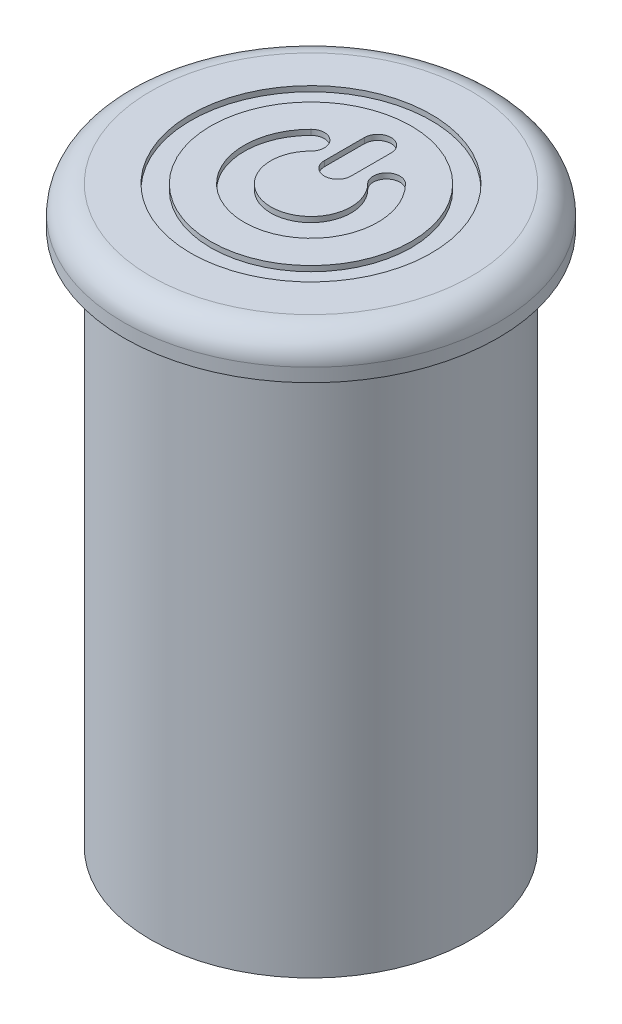
ISO-10303-21;
HEADER;
FILE_DESCRIPTION(('STEP AP214'),'2;1');
FILE_NAME('part.step','',(''),(''),'','','');
FILE_SCHEMA(('AUTOMOTIVE_DESIGN { 1 0 10303 214 1 1 1 1 }'));
ENDSEC;
DATA;
#1=APPLICATION_CONTEXT('core data for automotive mechanical design processes');
#2=APPLICATION_PROTOCOL_DEFINITION('international standard','automotive_design',2000,#1);
#3=PRODUCT_CONTEXT('',#1,'mechanical');
#4=PRODUCT('Part','Part','',(#3));
#5=PRODUCT_RELATED_PRODUCT_CATEGORY('part','',(#4));
#6=PRODUCT_DEFINITION_FORMATION('','',#4);
#7=PRODUCT_DEFINITION_CONTEXT('part definition',#1,'design');
#8=PRODUCT_DEFINITION('design','',#6,#7);
#9=PRODUCT_DEFINITION_SHAPE('','',#8);
#10=(LENGTH_UNIT() NAMED_UNIT(*) SI_UNIT(.MILLI.,.METRE.));
#11=(NAMED_UNIT(*) PLANE_ANGLE_UNIT() SI_UNIT($,.RADIAN.));
#12=(NAMED_UNIT(*) SI_UNIT($,.STERADIAN.) SOLID_ANGLE_UNIT());
#13=UNCERTAINTY_MEASURE_WITH_UNIT(LENGTH_MEASURE(1.E-05),#10,'distance_accuracy_value','');
#14=(GEOMETRIC_REPRESENTATION_CONTEXT(3) GLOBAL_UNCERTAINTY_ASSIGNED_CONTEXT((#13)) GLOBAL_UNIT_ASSIGNED_CONTEXT((#10,
#11,#12)) REPRESENTATION_CONTEXT('',''));
#15=CARTESIAN_POINT('',(0.,0.,0.));
#16=DIRECTION('',(0.,0.,1.));
#17=DIRECTION('',(1.,0.,0.));
#18=AXIS2_PLACEMENT_3D('',#15,#16,#17);
#19=CARTESIAN_POINT('',(0.,0.,0.));
#20=DIRECTION('',(0.,1.,0.));
#21=DIRECTION('',(0.,0.,1.));
#22=AXIS2_PLACEMENT_3D('',#19,#20,#21);
#23=PLANE('',#22);
#24=CARTESIAN_POINT('',(0.,0.,0.));
#25=DIRECTION('',(0.,1.,0.));
#26=DIRECTION('',(0.,0.,1.));
#27=AXIS2_PLACEMENT_3D('',#24,#25,#26);
#28=CIRCLE('',#27,4.5);
#29=CARTESIAN_POINT('',(0.,0.,4.5));
#30=VERTEX_POINT('',#29);
#31=EDGE_CURVE('E180',#30,#30,#28,.T.);
#32=ORIENTED_EDGE('',*,*,#31,.F.);
#33=EDGE_LOOP('',(#32));
#34=FACE_BOUND('',#33,.T.);
#35=CARTESIAN_POINT('',(0.,0.,0.));
#36=DIRECTION('',(0.,1.,0.));
#37=DIRECTION('',(0.,0.,1.));
#38=AXIS2_PLACEMENT_3D('',#35,#36,#37);
#39=CIRCLE('',#38,6.);
#40=CARTESIAN_POINT('',(0.,0.,6.));
#41=VERTEX_POINT('',#40);
#42=EDGE_CURVE('E12',#41,#41,#39,.T.);
#43=ORIENTED_EDGE('',*,*,#42,.T.);
#44=EDGE_LOOP('',(#43));
#45=FACE_BOUND('',#44,.T.);
#46=ADVANCED_FACE('F89',(#34,#45),#23,.T.);
#47=CARTESIAN_POINT('',(0.,0.,0.));
#48=DIRECTION('',(0.,-1.,0.));
#49=DIRECTION('',(0.,0.,-1.));
#50=AXIS2_PLACEMENT_3D('',#47,#48,#49);
#51=CYLINDRICAL_SURFACE('',#50,7.);
#52=CARTESIAN_POINT('',(0.,-1.,0.));
#53=DIRECTION('',(0.,1.,0.));
#54=DIRECTION('',(0.,0.,1.));
#55=AXIS2_PLACEMENT_3D('',#52,#53,#54);
#56=CIRCLE('',#55,7.);
#57=CARTESIAN_POINT('',(0.,-1.,7.));
#58=VERTEX_POINT('',#57);
#59=EDGE_CURVE('E97',#58,#58,#56,.F.);
#60=ORIENTED_EDGE('',*,*,#59,.T.);
#61=EDGE_LOOP('',(#60));
#62=FACE_BOUND('',#61,.T.);
#63=CARTESIAN_POINT('',(0.,-1.5,0.));
#64=DIRECTION('',(0.,-1.,0.));
#65=DIRECTION('',(0.,0.,-1.));
#66=AXIS2_PLACEMENT_3D('',#63,#64,#65);
#67=CIRCLE('',#66,7.);
#68=CARTESIAN_POINT('',(0.,-1.5,-7.));
#69=VERTEX_POINT('',#68);
#70=EDGE_CURVE('E231',#69,#69,#67,.T.);
#71=ORIENTED_EDGE('',*,*,#70,.F.);
#72=EDGE_LOOP('',(#71));
#73=FACE_BOUND('',#72,.T.);
#74=ADVANCED_FACE('F236',(#62,#73),#51,.T.);
#75=CARTESIAN_POINT('',(7.,-1.5,0.));
#76=DIRECTION('',(0.,-1.,0.));
#77=DIRECTION('',(0.,0.,-1.));
#78=AXIS2_PLACEMENT_3D('',#75,#76,#77);
#79=PLANE('',#78);
#80=ORIENTED_EDGE('',*,*,#70,.T.);
#81=EDGE_LOOP('',(#80));
#82=FACE_BOUND('',#81,.T.);
#83=CARTESIAN_POINT('',(0.,-1.5,0.));
#84=DIRECTION('',(0.,-1.,0.));
#85=DIRECTION('',(0.,0.,-1.));
#86=AXIS2_PLACEMENT_3D('',#83,#84,#85);
#87=CIRCLE('',#86,6.);
#88=CARTESIAN_POINT('',(0.,-1.5,-6.));
#89=VERTEX_POINT('',#88);
#90=EDGE_CURVE('E228',#89,#89,#87,.T.);
#91=ORIENTED_EDGE('',*,*,#90,.F.);
#92=EDGE_LOOP('',(#91));
#93=FACE_BOUND('',#92,.T.);
#94=ADVANCED_FACE('F260',(#82,#93),#79,.T.);
#95=CARTESIAN_POINT('',(0.,0.,0.));
#96=DIRECTION('',(0.,-1.,0.));
#97=DIRECTION('',(0.,0.,-1.));
#98=AXIS2_PLACEMENT_3D('',#95,#96,#97);
#99=CYLINDRICAL_SURFACE('',#98,6.);
#100=ORIENTED_EDGE('',*,*,#90,.T.);
#101=EDGE_LOOP('',(#100));
#102=FACE_BOUND('',#101,.T.);
#103=CARTESIAN_POINT('',(0.,-21.5,0.));
#104=DIRECTION('',(0.,-1.,0.));
#105=DIRECTION('',(0.,0.,-1.));
#106=AXIS2_PLACEMENT_3D('',#103,#104,#105);
#107=CIRCLE('',#106,6.);
#108=CARTESIAN_POINT('',(0.,-21.5,-6.));
#109=VERTEX_POINT('',#108);
#110=EDGE_CURVE('E220',#109,#109,#107,.T.);
#111=ORIENTED_EDGE('',*,*,#110,.F.);
#112=EDGE_LOOP('',(#111));
#113=FACE_BOUND('',#112,.T.);
#114=ADVANCED_FACE('F250',(#102,#113),#99,.T.);
#115=CARTESIAN_POINT('',(6.,-21.5,0.));
#116=DIRECTION('',(0.,-1.,0.));
#117=DIRECTION('',(0.,0.,-1.));
#118=AXIS2_PLACEMENT_3D('',#115,#116,#117);
#119=PLANE('',#118);
#120=ORIENTED_EDGE('',*,*,#110,.T.);
#121=EDGE_LOOP('',(#120));
#122=FACE_BOUND('',#121,.T.);
#123=ADVANCED_FACE('F241',(#122),#119,.T.);
#124=CARTESIAN_POINT('',(0.,-1.,0.));
#125=DIRECTION('',(0.,1.,0.));
#126=DIRECTION('',(0.,0.,1.));
#127=AXIS2_PLACEMENT_3D('',#124,#125,#126);
#128=TOROIDAL_SURFACE('',#127,6.,1.);
#129=ORIENTED_EDGE('',*,*,#42,.F.);
#130=EDGE_LOOP('',(#129));
#131=FACE_BOUND('',#130,.T.);
#132=ORIENTED_EDGE('',*,*,#59,.F.);
#133=EDGE_LOOP('',(#132));
#134=FACE_BOUND('',#133,.T.);
#135=ADVANCED_FACE('F91',(#131,#134),#128,.T.);
#136=CARTESIAN_POINT('',(0.,-0.2,0.));
#137=DIRECTION('',(0.,1.,0.));
#138=DIRECTION('',(0.,0.,1.));
#139=AXIS2_PLACEMENT_3D('',#136,#137,#138);
#140=CYLINDRICAL_SURFACE('',#139,3.75);
#141=CARTESIAN_POINT('',(0.,-0.2,0.));
#142=DIRECTION('',(0.,1.,0.));
#143=DIRECTION('',(0.,0.,1.));
#144=AXIS2_PLACEMENT_3D('',#141,#142,#143);
#145=CIRCLE('',#144,3.75);
#146=CARTESIAN_POINT('',(0.,-0.2,3.75));
#147=VERTEX_POINT('',#146);
#148=EDGE_CURVE('E286',#147,#147,#145,.T.);
#149=ORIENTED_EDGE('',*,*,#148,.T.);
#150=EDGE_LOOP('',(#149));
#151=FACE_BOUND('',#150,.T.);
#152=CARTESIAN_POINT('',(0.,0.,0.));
#153=DIRECTION('',(0.,1.,0.));
#154=DIRECTION('',(0.,0.,1.));
#155=AXIS2_PLACEMENT_3D('',#152,#153,#154);
#156=CIRCLE('',#155,3.75);
#157=CARTESIAN_POINT('',(0.,0.,3.75));
#158=VERTEX_POINT('',#157);
#159=EDGE_CURVE('E283',#158,#158,#156,.T.);
#160=ORIENTED_EDGE('',*,*,#159,.F.);
#161=EDGE_LOOP('',(#160));
#162=FACE_BOUND('',#161,.T.);
#163=ADVANCED_FACE('F240',(#151,#162),#140,.T.);
#164=CARTESIAN_POINT('',(0.,-0.2,0.));
#165=DIRECTION('',(0.,1.,0.));
#166=DIRECTION('',(0.,0.,1.));
#167=AXIS2_PLACEMENT_3D('',#164,#165,#166);
#168=CYLINDRICAL_SURFACE('',#167,4.5);
#169=CARTESIAN_POINT('',(0.,-0.2,0.));
#170=DIRECTION('',(0.,1.,0.));
#171=DIRECTION('',(0.,0.,1.));
#172=AXIS2_PLACEMENT_3D('',#169,#170,#171);
#173=CIRCLE('',#172,4.5);
#174=CARTESIAN_POINT('',(0.,-0.2,4.5));
#175=VERTEX_POINT('',#174);
#176=EDGE_CURVE('E187',#175,#175,#173,.T.);
#177=ORIENTED_EDGE('',*,*,#176,.F.);
#178=EDGE_LOOP('',(#177));
#179=FACE_BOUND('',#178,.T.);
#180=ORIENTED_EDGE('',*,*,#31,.T.);
#181=EDGE_LOOP('',(#180));
#182=FACE_BOUND('',#181,.T.);
#183=ADVANCED_FACE('F247',(#179,#182),#168,.F.);
#184=CARTESIAN_POINT('',(0.,-0.2,0.));
#185=DIRECTION('',(0.,1.,0.));
#186=DIRECTION('',(0.,0.,1.));
#187=AXIS2_PLACEMENT_3D('',#184,#185,#186);
#188=PLANE('',#187);
#189=ORIENTED_EDGE('',*,*,#148,.F.);
#190=EDGE_LOOP('',(#189));
#191=FACE_BOUND('',#190,.T.);
#192=ORIENTED_EDGE('',*,*,#176,.T.);
#193=EDGE_LOOP('',(#192));
#194=FACE_BOUND('',#193,.T.);
#195=ADVANCED_FACE('F266',(#191,#194),#188,.T.);
#196=CARTESIAN_POINT('',(0.,0.,0.));
#197=DIRECTION('',(0.,1.,0.));
#198=DIRECTION('',(0.,0.,1.));
#199=AXIS2_PLACEMENT_3D('',#196,#197,#198);
#200=CIRCLE('',#199,2.5);
#201=CARTESIAN_POINT('',(-1.76776695296636,0.,-1.76776695296638));
#202=VERTEX_POINT('',#201);
#203=CARTESIAN_POINT('',(1.76776695296637,0.,-1.76776695296637));
#204=VERTEX_POINT('',#203);
#205=EDGE_CURVE('E104',#202,#204,#200,.T.);
#206=ORIENTED_EDGE('',*,*,#205,.F.);
#207=CARTESIAN_POINT('',(-1.41421356237309,0.,-1.4142135623731));
#208=DIRECTION('',(0.,1.,0.));
#209=DIRECTION('',(0.,0.,1.));
#210=AXIS2_PLACEMENT_3D('',#207,#208,#209);
#211=CIRCLE('',#210,0.5);
#212=CARTESIAN_POINT('',(-1.06066017177982,0.,-1.06066017177983));
#213=VERTEX_POINT('',#212);
#214=EDGE_CURVE('E174',#213,#202,#211,.T.);
#215=ORIENTED_EDGE('',*,*,#214,.F.);
#216=CARTESIAN_POINT('',(0.,0.,0.));
#217=DIRECTION('',(0.,1.,0.));
#218=DIRECTION('',(0.,0.,1.));
#219=AXIS2_PLACEMENT_3D('',#216,#217,#218);
#220=CIRCLE('',#219,1.5);
#221=CARTESIAN_POINT('',(1.06066017177982,0.,-1.06066017177982));
#222=VERTEX_POINT('',#221);
#223=EDGE_CURVE('E177',#213,#222,#220,.T.);
#224=ORIENTED_EDGE('',*,*,#223,.T.);
#225=CARTESIAN_POINT('',(1.41421356237309,0.,-1.41421356237309));
#226=DIRECTION('',(0.,1.,0.));
#227=DIRECTION('',(0.,0.,1.));
#228=AXIS2_PLACEMENT_3D('',#225,#226,#227);
#229=CIRCLE('',#228,0.5);
#230=EDGE_CURVE('E186',#204,#222,#229,.T.);
#231=ORIENTED_EDGE('',*,*,#230,.F.);
#232=EDGE_LOOP('',(#206,#215,#224,#231));
#233=FACE_BOUND('',#232,.T.);
#234=DIRECTION('',(0.,0.,1.));
#235=VECTOR('',#234,1.);
#236=CARTESIAN_POINT('',(-0.5,0.,0.));
#237=LINE('',#236,#235);
#238=CARTESIAN_POINT('',(-0.5,0.,-2.5));
#239=VERTEX_POINT('',#238);
#240=CARTESIAN_POINT('',(-0.5,0.,-1.));
#241=VERTEX_POINT('',#240);
#242=EDGE_CURVE('E112',#239,#241,#237,.T.);
#243=ORIENTED_EDGE('',*,*,#242,.F.);
#244=CARTESIAN_POINT('',(0.,0.,-2.5));
#245=DIRECTION('',(0.,1.,0.));
#246=DIRECTION('',(0.,0.,1.));
#247=AXIS2_PLACEMENT_3D('',#244,#245,#246);
#248=CIRCLE('',#247,0.5);
#249=CARTESIAN_POINT('',(0.5,0.,-2.5));
#250=VERTEX_POINT('',#249);
#251=EDGE_CURVE('E200',#250,#239,#248,.T.);
#252=ORIENTED_EDGE('',*,*,#251,.F.);
#253=DIRECTION('',(0.,0.,1.));
#254=VECTOR('',#253,1.);
#255=CARTESIAN_POINT('',(0.5,0.,0.));
#256=LINE('',#255,#254);
#257=CARTESIAN_POINT('',(0.5,0.,-1.));
#258=VERTEX_POINT('',#257);
#259=EDGE_CURVE('E213',#250,#258,#256,.T.);
#260=ORIENTED_EDGE('',*,*,#259,.T.);
#261=CARTESIAN_POINT('',(0.,0.,-1.));
#262=DIRECTION('',(0.,1.,0.));
#263=DIRECTION('',(0.,0.,1.));
#264=AXIS2_PLACEMENT_3D('',#261,#262,#263);
#265=CIRCLE('',#264,0.5);
#266=EDGE_CURVE('E210',#241,#258,#265,.T.);
#267=ORIENTED_EDGE('',*,*,#266,.F.);
#268=EDGE_LOOP('',(#243,#252,#260,#267));
#269=FACE_BOUND('',#268,.T.);
#270=ORIENTED_EDGE('',*,*,#159,.T.);
#271=EDGE_LOOP('',(#270));
#272=FACE_BOUND('',#271,.T.);
#273=ADVANCED_FACE('F256',(#233,#269,#272),#23,.T.);
#274=CARTESIAN_POINT('',(-0.5,-0.2,0.));
#275=DIRECTION('',(-1.,0.,0.));
#276=DIRECTION('',(0.,0.,1.));
#277=AXIS2_PLACEMENT_3D('',#274,#275,#276);
#278=PLANE('',#277);
#279=ORIENTED_EDGE('',*,*,#242,.T.);
#280=DIRECTION('',(0.,1.,0.));
#281=VECTOR('',#280,1.);
#282=CARTESIAN_POINT('',(-0.5,-0.2,-1.));
#283=LINE('',#282,#281);
#284=CARTESIAN_POINT('',(-0.5,-0.2,-1.));
#285=VERTEX_POINT('',#284);
#286=EDGE_CURVE('E208',#285,#241,#283,.T.);
#287=ORIENTED_EDGE('',*,*,#286,.F.);
#288=DIRECTION('',(0.,0.,1.));
#289=VECTOR('',#288,1.);
#290=CARTESIAN_POINT('',(-0.5,-0.2,0.));
#291=LINE('',#290,#289);
#292=CARTESIAN_POINT('',(-0.5,-0.2,-2.5));
#293=VERTEX_POINT('',#292);
#294=EDGE_CURVE('E196',#293,#285,#291,.T.);
#295=ORIENTED_EDGE('',*,*,#294,.F.);
#296=DIRECTION('',(0.,1.,0.));
#297=VECTOR('',#296,1.);
#298=CARTESIAN_POINT('',(-0.5,-0.2,-2.5));
#299=LINE('',#298,#297);
#300=EDGE_CURVE('E218',#293,#239,#299,.T.);
#301=ORIENTED_EDGE('',*,*,#300,.T.);
#302=EDGE_LOOP('',(#279,#287,#295,#301));
#303=FACE_BOUND('',#302,.T.);
#304=ADVANCED_FACE('F265',(#303),#278,.F.);
#305=CARTESIAN_POINT('',(0.,-0.2,-2.5));
#306=DIRECTION('',(0.,1.,0.));
#307=DIRECTION('',(0.,0.,1.));
#308=AXIS2_PLACEMENT_3D('',#305,#306,#307);
#309=CYLINDRICAL_SURFACE('',#308,0.5);
#310=ORIENTED_EDGE('',*,*,#251,.T.);
#311=ORIENTED_EDGE('',*,*,#300,.F.);
#312=CARTESIAN_POINT('',(0.,-0.2,-2.5));
#313=DIRECTION('',(0.,1.,0.));
#314=DIRECTION('',(0.,0.,1.));
#315=AXIS2_PLACEMENT_3D('',#312,#313,#314);
#316=CIRCLE('',#315,0.5);
#317=CARTESIAN_POINT('',(0.5,-0.2,-2.5));
#318=VERTEX_POINT('',#317);
#319=EDGE_CURVE('E205',#318,#293,#316,.T.);
#320=ORIENTED_EDGE('',*,*,#319,.F.);
#321=DIRECTION('',(0.,1.,0.));
#322=VECTOR('',#321,1.);
#323=CARTESIAN_POINT('',(0.5,-0.2,-2.5));
#324=LINE('',#323,#322);
#325=EDGE_CURVE('E221',#318,#250,#324,.T.);
#326=ORIENTED_EDGE('',*,*,#325,.T.);
#327=EDGE_LOOP('',(#310,#311,#320,#326));
#328=FACE_BOUND('',#327,.T.);
#329=ADVANCED_FACE('F272',(#328),#309,.F.);
#330=CARTESIAN_POINT('',(0.5,-0.2,0.));
#331=DIRECTION('',(-1.,0.,0.));
#332=DIRECTION('',(0.,0.,1.));
#333=AXIS2_PLACEMENT_3D('',#330,#331,#332);
#334=PLANE('',#333);
#335=ORIENTED_EDGE('',*,*,#259,.F.);
#336=ORIENTED_EDGE('',*,*,#325,.F.);
#337=DIRECTION('',(0.,0.,1.));
#338=VECTOR('',#337,1.);
#339=CARTESIAN_POINT('',(0.5,-0.2,0.));
#340=LINE('',#339,#338);
#341=CARTESIAN_POINT('',(0.5,-0.2,-1.));
#342=VERTEX_POINT('',#341);
#343=EDGE_CURVE('E203',#318,#342,#340,.T.);
#344=ORIENTED_EDGE('',*,*,#343,.T.);
#345=DIRECTION('',(0.,1.,0.));
#346=VECTOR('',#345,1.);
#347=CARTESIAN_POINT('',(0.5,-0.2,-1.));
#348=LINE('',#347,#346);
#349=EDGE_CURVE('E223',#342,#258,#348,.T.);
#350=ORIENTED_EDGE('',*,*,#349,.T.);
#351=EDGE_LOOP('',(#335,#336,#344,#350));
#352=FACE_BOUND('',#351,.T.);
#353=ADVANCED_FACE('F322',(#352),#334,.T.);
#354=CARTESIAN_POINT('',(0.,-0.2,-1.));
#355=DIRECTION('',(0.,1.,0.));
#356=DIRECTION('',(0.,0.,1.));
#357=AXIS2_PLACEMENT_3D('',#354,#355,#356);
#358=CYLINDRICAL_SURFACE('',#357,0.5);
#359=ORIENTED_EDGE('',*,*,#266,.T.);
#360=ORIENTED_EDGE('',*,*,#349,.F.);
#361=CARTESIAN_POINT('',(0.,-0.2,-1.));
#362=DIRECTION('',(0.,1.,0.));
#363=DIRECTION('',(0.,0.,1.));
#364=AXIS2_PLACEMENT_3D('',#361,#362,#363);
#365=CIRCLE('',#364,0.5);
#366=EDGE_CURVE('E199',#285,#342,#365,.T.);
#367=ORIENTED_EDGE('',*,*,#366,.F.);
#368=ORIENTED_EDGE('',*,*,#286,.T.);
#369=EDGE_LOOP('',(#359,#360,#367,#368));
#370=FACE_BOUND('',#369,.T.);
#371=ADVANCED_FACE('F318',(#370),#358,.F.);
#372=CARTESIAN_POINT('',(0.,-0.2,0.));
#373=DIRECTION('',(0.,1.,0.));
#374=DIRECTION('',(0.,0.,1.));
#375=AXIS2_PLACEMENT_3D('',#372,#373,#374);
#376=PLANE('',#375);
#377=ORIENTED_EDGE('',*,*,#294,.T.);
#378=ORIENTED_EDGE('',*,*,#366,.T.);
#379=ORIENTED_EDGE('',*,*,#343,.F.);
#380=ORIENTED_EDGE('',*,*,#319,.T.);
#381=EDGE_LOOP('',(#377,#378,#379,#380));
#382=FACE_BOUND('',#381,.T.);
#383=ADVANCED_FACE('F315',(#382),#376,.T.);
#384=CARTESIAN_POINT('',(0.,-0.2,0.));
#385=DIRECTION('',(0.,1.,0.));
#386=DIRECTION('',(0.,0.,1.));
#387=AXIS2_PLACEMENT_3D('',#384,#385,#386);
#388=CYLINDRICAL_SURFACE('',#387,2.5);
#389=ORIENTED_EDGE('',*,*,#205,.T.);
#390=DIRECTION('',(0.,1.,0.));
#391=VECTOR('',#390,1.);
#392=CARTESIAN_POINT('',(1.76776695296637,-0.2,-1.76776695296637));
#393=LINE('',#392,#391);
#394=CARTESIAN_POINT('',(1.76776695296637,-0.2,-1.76776695296637));
#395=VERTEX_POINT('',#394);
#396=EDGE_CURVE('E152',#395,#204,#393,.T.);
#397=ORIENTED_EDGE('',*,*,#396,.F.);
#398=CARTESIAN_POINT('',(0.,-0.2,0.));
#399=DIRECTION('',(0.,1.,0.));
#400=DIRECTION('',(0.,0.,1.));
#401=AXIS2_PLACEMENT_3D('',#398,#399,#400);
#402=CIRCLE('',#401,2.5);
#403=CARTESIAN_POINT('',(-1.76776695296636,-0.2,-1.76776695296638));
#404=VERTEX_POINT('',#403);
#405=EDGE_CURVE('E156',#404,#395,#402,.T.);
#406=ORIENTED_EDGE('',*,*,#405,.F.);
#407=DIRECTION('',(0.,1.,0.));
#408=VECTOR('',#407,1.);
#409=CARTESIAN_POINT('',(-1.76776695296636,-0.2,-1.76776695296638));
#410=LINE('',#409,#408);
#411=EDGE_CURVE('E191',#404,#202,#410,.T.);
#412=ORIENTED_EDGE('',*,*,#411,.T.);
#413=EDGE_LOOP('',(#389,#397,#406,#412));
#414=FACE_BOUND('',#413,.T.);
#415=ADVANCED_FACE('F154',(#414),#388,.F.);
#416=CARTESIAN_POINT('',(-1.41421356237309,-0.2,-1.4142135623731));
#417=DIRECTION('',(0.,1.,0.));
#418=DIRECTION('',(0.,0.,1.));
#419=AXIS2_PLACEMENT_3D('',#416,#417,#418);
#420=CYLINDRICAL_SURFACE('',#419,0.5);
#421=ORIENTED_EDGE('',*,*,#214,.T.);
#422=ORIENTED_EDGE('',*,*,#411,.F.);
#423=CARTESIAN_POINT('',(-1.41421356237309,-0.2,-1.4142135623731));
#424=DIRECTION('',(0.,1.,0.));
#425=DIRECTION('',(0.,0.,1.));
#426=AXIS2_PLACEMENT_3D('',#423,#424,#425);
#427=CIRCLE('',#426,0.5);
#428=CARTESIAN_POINT('',(-1.06066017177982,-0.2,-1.06066017177983));
#429=VERTEX_POINT('',#428);
#430=EDGE_CURVE('E162',#429,#404,#427,.T.);
#431=ORIENTED_EDGE('',*,*,#430,.F.);
#432=DIRECTION('',(0.,1.,0.));
#433=VECTOR('',#432,1.);
#434=CARTESIAN_POINT('',(-1.06066017177982,-0.2,-1.06066017177983));
#435=LINE('',#434,#433);
#436=EDGE_CURVE('E193',#429,#213,#435,.T.);
#437=ORIENTED_EDGE('',*,*,#436,.T.);
#438=EDGE_LOOP('',(#421,#422,#431,#437));
#439=FACE_BOUND('',#438,.T.);
#440=ADVANCED_FACE('F303',(#439),#420,.F.);
#441=CARTESIAN_POINT('',(0.,-0.2,0.));
#442=DIRECTION('',(0.,1.,0.));
#443=DIRECTION('',(0.,0.,1.));
#444=AXIS2_PLACEMENT_3D('',#441,#442,#443);
#445=CYLINDRICAL_SURFACE('',#444,1.5);
#446=ORIENTED_EDGE('',*,*,#223,.F.);
#447=ORIENTED_EDGE('',*,*,#436,.F.);
#448=CARTESIAN_POINT('',(0.,-0.2,0.));
#449=DIRECTION('',(0.,1.,0.));
#450=DIRECTION('',(0.,0.,1.));
#451=AXIS2_PLACEMENT_3D('',#448,#449,#450);
#452=CIRCLE('',#451,1.5);
#453=CARTESIAN_POINT('',(1.06066017177982,-0.2,-1.06066017177982));
#454=VERTEX_POINT('',#453);
#455=EDGE_CURVE('E170',#429,#454,#452,.T.);
#456=ORIENTED_EDGE('',*,*,#455,.T.);
#457=DIRECTION('',(0.,1.,0.));
#458=VECTOR('',#457,1.);
#459=CARTESIAN_POINT('',(1.06066017177982,-0.2,-1.06066017177982));
#460=LINE('',#459,#458);
#461=EDGE_CURVE('E161',#454,#222,#460,.T.);
#462=ORIENTED_EDGE('',*,*,#461,.T.);
#463=EDGE_LOOP('',(#446,#447,#456,#462));
#464=FACE_BOUND('',#463,.T.);
#465=ADVANCED_FACE('F306',(#464),#445,.T.);
#466=CARTESIAN_POINT('',(1.41421356237309,-0.2,-1.41421356237309));
#467=DIRECTION('',(0.,1.,0.));
#468=DIRECTION('',(0.,0.,1.));
#469=AXIS2_PLACEMENT_3D('',#466,#467,#468);
#470=CYLINDRICAL_SURFACE('',#469,0.5);
#471=ORIENTED_EDGE('',*,*,#230,.T.);
#472=ORIENTED_EDGE('',*,*,#461,.F.);
#473=CARTESIAN_POINT('',(1.41421356237309,-0.2,-1.41421356237309));
#474=DIRECTION('',(0.,1.,0.));
#475=DIRECTION('',(0.,0.,1.));
#476=AXIS2_PLACEMENT_3D('',#473,#474,#475);
#477=CIRCLE('',#476,0.5);
#478=EDGE_CURVE('E166',#395,#454,#477,.T.);
#479=ORIENTED_EDGE('',*,*,#478,.F.);
#480=ORIENTED_EDGE('',*,*,#396,.T.);
#481=EDGE_LOOP('',(#471,#472,#479,#480));
#482=FACE_BOUND('',#481,.T.);
#483=ADVANCED_FACE('F167',(#482),#470,.F.);
#484=CARTESIAN_POINT('',(0.,-0.2,0.));
#485=DIRECTION('',(0.,1.,0.));
#486=DIRECTION('',(0.,0.,1.));
#487=AXIS2_PLACEMENT_3D('',#484,#485,#486);
#488=PLANE('',#487);
#489=ORIENTED_EDGE('',*,*,#405,.T.);
#490=ORIENTED_EDGE('',*,*,#478,.T.);
#491=ORIENTED_EDGE('',*,*,#455,.F.);
#492=ORIENTED_EDGE('',*,*,#430,.T.);
#493=EDGE_LOOP('',(#489,#490,#491,#492));
#494=FACE_BOUND('',#493,.T.);
#495=ADVANCED_FACE('F172',(#494),#488,.T.);
#496=CLOSED_SHELL('',(#46,#74,#94,#114,#123,#135,#163,#183,#195,#273,#304,#329,#353,#371,#383,
#415,#440,#465,#483,#495));
#497=MANIFOLD_SOLID_BREP('B2',#496);
#498=ADVANCED_BREP_SHAPE_REPRESENTATION('',(#18,#497),#14);
#499=SHAPE_DEFINITION_REPRESENTATION(#9,#498);
ENDSEC;
END-ISO-10303-21;
